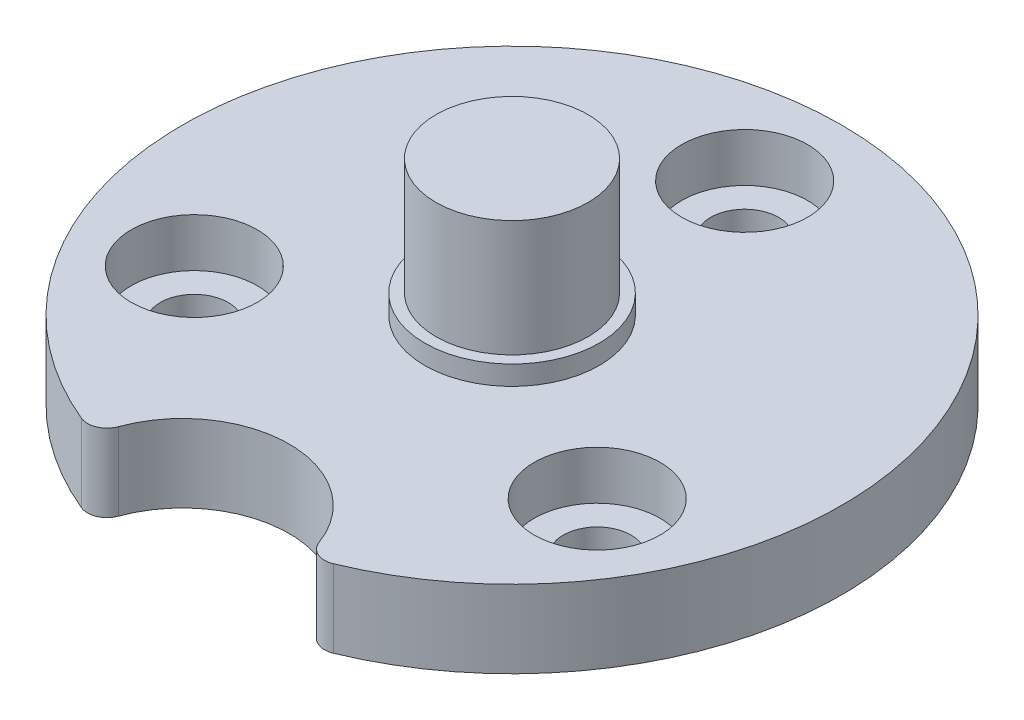
ISO-10303-21;
HEADER;
FILE_DESCRIPTION(('STEP AP214'),'2;1');
FILE_NAME('part.step','',(''),(''),'','','');
FILE_SCHEMA(('AUTOMOTIVE_DESIGN { 1 0 10303 214 1 1 1 1 }'));
ENDSEC;
DATA;
#1=APPLICATION_CONTEXT('core data for automotive mechanical design processes');
#2=APPLICATION_PROTOCOL_DEFINITION('international standard','automotive_design',2000,#1);
#3=PRODUCT_CONTEXT('',#1,'mechanical');
#4=PRODUCT('Part','Part','',(#3));
#5=PRODUCT_RELATED_PRODUCT_CATEGORY('part','',(#4));
#6=PRODUCT_DEFINITION_FORMATION('','',#4);
#7=PRODUCT_DEFINITION_CONTEXT('part definition',#1,'design');
#8=PRODUCT_DEFINITION('design','',#6,#7);
#9=PRODUCT_DEFINITION_SHAPE('','',#8);
#10=(LENGTH_UNIT() NAMED_UNIT(*) SI_UNIT(.MILLI.,.METRE.));
#11=(NAMED_UNIT(*) PLANE_ANGLE_UNIT() SI_UNIT($,.RADIAN.));
#12=(NAMED_UNIT(*) SI_UNIT($,.STERADIAN.) SOLID_ANGLE_UNIT());
#13=UNCERTAINTY_MEASURE_WITH_UNIT(LENGTH_MEASURE(1.E-05),#10,'distance_accuracy_value','');
#14=(GEOMETRIC_REPRESENTATION_CONTEXT(3) GLOBAL_UNCERTAINTY_ASSIGNED_CONTEXT((#13)) GLOBAL_UNIT_ASSIGNED_CONTEXT((#10,
#11,#12)) REPRESENTATION_CONTEXT('',''));
#15=CARTESIAN_POINT('',(0.,0.,0.));
#16=DIRECTION('',(0.,0.,1.));
#17=DIRECTION('',(1.,0.,0.));
#18=AXIS2_PLACEMENT_3D('',#15,#16,#17);
#19=CARTESIAN_POINT('',(0.,4.,-12.));
#20=DIRECTION('',(0.,-1.,0.));
#21=DIRECTION('',(0.,0.,-1.));
#22=AXIS2_PLACEMENT_3D('',#19,#20,#21);
#23=CYLINDRICAL_SURFACE('',#22,1.75);
#24=CARTESIAN_POINT('',(0.,0.,-12.));
#25=DIRECTION('',(0.,1.,0.));
#26=DIRECTION('',(0.,0.,1.));
#27=AXIS2_PLACEMENT_3D('',#24,#25,#26);
#28=CIRCLE('',#27,1.75);
#29=CARTESIAN_POINT('',(0.,0.,-10.25));
#30=VERTEX_POINT('',#29);
#31=EDGE_CURVE('E146',#30,#30,#28,.T.);
#32=ORIENTED_EDGE('',*,*,#31,.F.);
#33=EDGE_LOOP('',(#32));
#34=FACE_BOUND('',#33,.T.);
#35=CARTESIAN_POINT('',(0.,1.5,-12.));
#36=DIRECTION('',(0.,1.,0.));
#37=DIRECTION('',(0.,0.,1.));
#38=AXIS2_PLACEMENT_3D('',#35,#36,#37);
#39=CIRCLE('',#38,1.75);
#40=CARTESIAN_POINT('',(0.,1.5,-10.25));
#41=VERTEX_POINT('',#40);
#42=EDGE_CURVE('E143',#41,#41,#39,.T.);
#43=ORIENTED_EDGE('',*,*,#42,.T.);
#44=EDGE_LOOP('',(#43));
#45=FACE_BOUND('',#44,.T.);
#46=ADVANCED_FACE('F41',(#34,#45),#23,.F.);
#47=CARTESIAN_POINT('',(10.3923048454138,4.,5.99999999999971));
#48=DIRECTION('',(0.,-1.,0.));
#49=DIRECTION('',(0.,0.,-1.));
#50=AXIS2_PLACEMENT_3D('',#47,#48,#49);
#51=CYLINDRICAL_SURFACE('',#50,1.75);
#52=CARTESIAN_POINT('',(10.3923048454138,0.,5.99999999999971));
#53=DIRECTION('',(0.,1.,0.));
#54=DIRECTION('',(0.,0.,1.));
#55=AXIS2_PLACEMENT_3D('',#52,#53,#54);
#56=CIRCLE('',#55,1.75);
#57=CARTESIAN_POINT('',(10.3923048454138,0.,7.74999999999971));
#58=VERTEX_POINT('',#57);
#59=EDGE_CURVE('E142',#58,#58,#56,.T.);
#60=ORIENTED_EDGE('',*,*,#59,.F.);
#61=EDGE_LOOP('',(#60));
#62=FACE_BOUND('',#61,.T.);
#63=CARTESIAN_POINT('',(10.3923048454138,1.5,5.99999999999971));
#64=DIRECTION('',(0.,1.,0.));
#65=DIRECTION('',(0.,0.,1.));
#66=AXIS2_PLACEMENT_3D('',#63,#64,#65);
#67=CIRCLE('',#66,1.75);
#68=CARTESIAN_POINT('',(10.3923048454138,1.5,7.74999999999971));
#69=VERTEX_POINT('',#68);
#70=EDGE_CURVE('E154',#69,#69,#67,.T.);
#71=ORIENTED_EDGE('',*,*,#70,.T.);
#72=EDGE_LOOP('',(#71));
#73=FACE_BOUND('',#72,.T.);
#74=ADVANCED_FACE('F195',(#62,#73),#51,.F.);
#75=CARTESIAN_POINT('',(-10.3923048454128,4.,6.0000000000003));
#76=DIRECTION('',(0.,-1.,0.));
#77=DIRECTION('',(0.,0.,-1.));
#78=AXIS2_PLACEMENT_3D('',#75,#76,#77);
#79=CYLINDRICAL_SURFACE('',#78,1.75);
#80=CARTESIAN_POINT('',(-10.3923048454128,0.,6.0000000000003));
#81=DIRECTION('',(0.,1.,0.));
#82=DIRECTION('',(0.,0.,1.));
#83=AXIS2_PLACEMENT_3D('',#80,#81,#82);
#84=CIRCLE('',#83,1.75);
#85=CARTESIAN_POINT('',(-10.3923048454128,0.,7.7500000000003));
#86=VERTEX_POINT('',#85);
#87=EDGE_CURVE('E139',#86,#86,#84,.T.);
#88=ORIENTED_EDGE('',*,*,#87,.F.);
#89=EDGE_LOOP('',(#88));
#90=FACE_BOUND('',#89,.T.);
#91=CARTESIAN_POINT('',(-10.3923048454128,1.5,6.0000000000003));
#92=DIRECTION('',(0.,1.,0.));
#93=DIRECTION('',(0.,0.,1.));
#94=AXIS2_PLACEMENT_3D('',#91,#92,#93);
#95=CIRCLE('',#94,1.75);
#96=CARTESIAN_POINT('',(-10.3923048454128,1.5,7.7500000000003));
#97=VERTEX_POINT('',#96);
#98=EDGE_CURVE('E124',#97,#97,#95,.T.);
#99=ORIENTED_EDGE('',*,*,#98,.T.);
#100=EDGE_LOOP('',(#99));
#101=FACE_BOUND('',#100,.T.);
#102=ADVANCED_FACE('F168',(#90,#101),#79,.F.);
#103=CARTESIAN_POINT('',(0.,4.,0.));
#104=DIRECTION('',(0.,1.,0.));
#105=DIRECTION('',(0.,0.,1.));
#106=AXIS2_PLACEMENT_3D('',#103,#104,#105);
#107=PLANE('',#106);
#108=CARTESIAN_POINT('',(0.,4.,0.));
#109=DIRECTION('',(0.,1.,0.));
#110=DIRECTION('',(0.,0.,1.));
#111=AXIS2_PLACEMENT_3D('',#108,#109,#110);
#112=CIRCLE('',#111,17.);
#113=CARTESIAN_POINT('',(6.49356934752327,4.,15.7109375));
#114=VERTEX_POINT('',#113);
#115=CARTESIAN_POINT('',(-6.49356934752327,4.,15.7109375));
#116=VERTEX_POINT('',#115);
#117=EDGE_CURVE('E114',#114,#116,#112,.T.);
#118=ORIENTED_EDGE('',*,*,#117,.T.);
#119=CARTESIAN_POINT('',(-6.1115946800219,4.,14.7867647058824));
#120=DIRECTION('',(0.,1.,0.));
#121=DIRECTION('',(0.,0.,1.));
#122=AXIS2_PLACEMENT_3D('',#119,#120,#121);
#123=CIRCLE('',#122,1.);
#124=CARTESIAN_POINT('',(-5.17134934463391,4.,15.1272624434389));
#125=VERTEX_POINT('',#124);
#126=EDGE_CURVE('E11',#116,#125,#123,.T.);
#127=ORIENTED_EDGE('',*,*,#126,.T.);
#128=CARTESIAN_POINT('',(0.,4.,17.));
#129=DIRECTION('',(0.,1.,0.));
#130=DIRECTION('',(0.,0.,1.));
#131=AXIS2_PLACEMENT_3D('',#128,#129,#130);
#132=CIRCLE('',#131,5.5);
#133=CARTESIAN_POINT('',(5.17134934463391,4.,15.1272624434389));
#134=VERTEX_POINT('',#133);
#135=EDGE_CURVE('E98',#134,#125,#132,.T.);
#136=ORIENTED_EDGE('',*,*,#135,.F.);
#137=CARTESIAN_POINT('',(6.1115946800219,4.,14.7867647058824));
#138=DIRECTION('',(0.,1.,0.));
#139=DIRECTION('',(0.,0.,1.));
#140=AXIS2_PLACEMENT_3D('',#137,#138,#139);
#141=CIRCLE('',#140,1.);
#142=EDGE_CURVE('E49',#134,#114,#141,.T.);
#143=ORIENTED_EDGE('',*,*,#142,.T.);
#144=EDGE_LOOP('',(#118,#127,#136,#143));
#145=FACE_BOUND('',#144,.T.);
#146=CARTESIAN_POINT('',(0.,4.,0.));
#147=DIRECTION('',(0.,1.,0.));
#148=DIRECTION('',(0.,0.,1.));
#149=AXIS2_PLACEMENT_3D('',#146,#147,#148);
#150=CIRCLE('',#149,4.5);
#151=CARTESIAN_POINT('',(0.,4.,4.5));
#152=VERTEX_POINT('',#151);
#153=EDGE_CURVE('E107',#152,#152,#150,.T.);
#154=ORIENTED_EDGE('',*,*,#153,.F.);
#155=EDGE_LOOP('',(#154));
#156=FACE_BOUND('',#155,.T.);
#157=CARTESIAN_POINT('',(0.,4.,-12.));
#158=DIRECTION('',(0.,1.,0.));
#159=DIRECTION('',(0.,0.,1.));
#160=AXIS2_PLACEMENT_3D('',#157,#158,#159);
#161=CIRCLE('',#160,3.25);
#162=CARTESIAN_POINT('',(0.,4.,-8.75));
#163=VERTEX_POINT('',#162);
#164=EDGE_CURVE('E125',#163,#163,#161,.T.);
#165=ORIENTED_EDGE('',*,*,#164,.F.);
#166=EDGE_LOOP('',(#165));
#167=FACE_BOUND('',#166,.T.);
#168=CARTESIAN_POINT('',(10.3923048454133,4.,6.));
#169=DIRECTION('',(0.,1.,0.));
#170=DIRECTION('',(0.,0.,1.));
#171=AXIS2_PLACEMENT_3D('',#168,#169,#170);
#172=CIRCLE('',#171,3.25);
#173=CARTESIAN_POINT('',(10.3923048454133,4.,9.25));
#174=VERTEX_POINT('',#173);
#175=EDGE_CURVE('E131',#174,#174,#172,.T.);
#176=ORIENTED_EDGE('',*,*,#175,.F.);
#177=EDGE_LOOP('',(#176));
#178=FACE_BOUND('',#177,.T.);
#179=CARTESIAN_POINT('',(-10.3923048454133,4.,6.00000000000001));
#180=DIRECTION('',(0.,1.,0.));
#181=DIRECTION('',(0.,0.,1.));
#182=AXIS2_PLACEMENT_3D('',#179,#180,#181);
#183=CIRCLE('',#182,3.25);
#184=CARTESIAN_POINT('',(-10.3923048454133,4.,9.25000000000001));
#185=VERTEX_POINT('',#184);
#186=EDGE_CURVE('E118',#185,#185,#183,.T.);
#187=ORIENTED_EDGE('',*,*,#186,.F.);
#188=EDGE_LOOP('',(#187));
#189=FACE_BOUND('',#188,.T.);
#190=ADVANCED_FACE('F165',(#145,#156,#167,#178,#189),#107,.T.);
#191=CARTESIAN_POINT('',(0.,0.,0.));
#192=DIRECTION('',(0.,1.,0.));
#193=DIRECTION('',(0.,0.,1.));
#194=AXIS2_PLACEMENT_3D('',#191,#192,#193);
#195=PLANE('',#194);
#196=CARTESIAN_POINT('',(0.,0.,17.));
#197=DIRECTION('',(0.,1.,0.));
#198=DIRECTION('',(0.,0.,1.));
#199=AXIS2_PLACEMENT_3D('',#196,#197,#198);
#200=CIRCLE('',#199,5.5);
#201=CARTESIAN_POINT('',(-5.17134934463391,0.,15.1272624434389));
#202=VERTEX_POINT('',#201);
#203=CARTESIAN_POINT('',(5.17134934463391,0.,15.1272624434389));
#204=VERTEX_POINT('',#203);
#205=EDGE_CURVE('E96',#202,#204,#200,.F.);
#206=ORIENTED_EDGE('',*,*,#205,.F.);
#207=CARTESIAN_POINT('',(-6.1115946800219,0.,14.7867647058824));
#208=DIRECTION('',(0.,1.,0.));
#209=DIRECTION('',(0.,0.,1.));
#210=AXIS2_PLACEMENT_3D('',#207,#208,#209);
#211=CIRCLE('',#210,1.);
#212=CARTESIAN_POINT('',(-6.49356934752327,0.,15.7109375));
#213=VERTEX_POINT('',#212);
#214=EDGE_CURVE('E80',#202,#213,#211,.F.);
#215=ORIENTED_EDGE('',*,*,#214,.T.);
#216=CARTESIAN_POINT('',(0.,0.,0.));
#217=DIRECTION('',(0.,1.,0.));
#218=DIRECTION('',(0.,0.,1.));
#219=AXIS2_PLACEMENT_3D('',#216,#217,#218);
#220=CIRCLE('',#219,17.);
#221=CARTESIAN_POINT('',(6.49356934752327,0.,15.7109375));
#222=VERTEX_POINT('',#221);
#223=EDGE_CURVE('E149',#222,#213,#220,.T.);
#224=ORIENTED_EDGE('',*,*,#223,.F.);
#225=CARTESIAN_POINT('',(6.1115946800219,0.,14.7867647058824));
#226=DIRECTION('',(0.,1.,0.));
#227=DIRECTION('',(0.,0.,1.));
#228=AXIS2_PLACEMENT_3D('',#225,#226,#227);
#229=CIRCLE('',#228,1.);
#230=EDGE_CURVE('E89',#222,#204,#229,.F.);
#231=ORIENTED_EDGE('',*,*,#230,.T.);
#232=EDGE_LOOP('',(#206,#215,#224,#231));
#233=FACE_BOUND('',#232,.T.);
#234=ORIENTED_EDGE('',*,*,#31,.T.);
#235=EDGE_LOOP('',(#234));
#236=FACE_BOUND('',#235,.T.);
#237=ORIENTED_EDGE('',*,*,#59,.T.);
#238=EDGE_LOOP('',(#237));
#239=FACE_BOUND('',#238,.T.);
#240=ORIENTED_EDGE('',*,*,#87,.T.);
#241=EDGE_LOOP('',(#240));
#242=FACE_BOUND('',#241,.T.);
#243=ADVANCED_FACE('F101',(#233,#236,#239,#242),#195,.F.);
#244=CARTESIAN_POINT('',(0.,4.,0.));
#245=DIRECTION('',(0.,-1.,0.));
#246=DIRECTION('',(0.,0.,-1.));
#247=AXIS2_PLACEMENT_3D('',#244,#245,#246);
#248=CYLINDRICAL_SURFACE('',#247,17.);
#249=ORIENTED_EDGE('',*,*,#223,.T.);
#250=DIRECTION('',(0.,-1.,0.));
#251=VECTOR('',#250,1.);
#252=CARTESIAN_POINT('',(-6.49356934752327,4.,15.7109375));
#253=LINE('',#252,#251);
#254=EDGE_CURVE('E56',#213,#116,#253,.F.);
#255=ORIENTED_EDGE('',*,*,#254,.T.);
#256=ORIENTED_EDGE('',*,*,#117,.F.);
#257=DIRECTION('',(0.,-1.,0.));
#258=VECTOR('',#257,1.);
#259=CARTESIAN_POINT('',(6.49356934752327,4.,15.7109375));
#260=LINE('',#259,#258);
#261=EDGE_CURVE('E88',#114,#222,#260,.T.);
#262=ORIENTED_EDGE('',*,*,#261,.T.);
#263=EDGE_LOOP('',(#249,#255,#256,#262));
#264=FACE_BOUND('',#263,.T.);
#265=ADVANCED_FACE('F163',(#264),#248,.T.);
#266=CARTESIAN_POINT('',(-10.3923048454133,1.5,6.00000000000001));
#267=DIRECTION('',(0.,1.,0.));
#268=DIRECTION('',(0.,0.,1.));
#269=AXIS2_PLACEMENT_3D('',#266,#267,#268);
#270=CYLINDRICAL_SURFACE('',#269,3.25);
#271=CARTESIAN_POINT('',(-10.3923048454133,1.5,6.00000000000001));
#272=DIRECTION('',(0.,1.,0.));
#273=DIRECTION('',(0.,0.,1.));
#274=AXIS2_PLACEMENT_3D('',#271,#272,#273);
#275=CIRCLE('',#274,3.25);
#276=CARTESIAN_POINT('',(-10.3923048454133,1.5,9.25000000000001));
#277=VERTEX_POINT('',#276);
#278=EDGE_CURVE('E134',#277,#277,#275,.T.);
#279=ORIENTED_EDGE('',*,*,#278,.F.);
#280=EDGE_LOOP('',(#279));
#281=FACE_BOUND('',#280,.T.);
#282=ORIENTED_EDGE('',*,*,#186,.T.);
#283=EDGE_LOOP('',(#282));
#284=FACE_BOUND('',#283,.T.);
#285=ADVANCED_FACE('F178',(#281,#284),#270,.F.);
#286=CARTESIAN_POINT('',(-10.3923048454133,1.5,6.00000000000001));
#287=DIRECTION('',(0.,1.,0.));
#288=DIRECTION('',(0.,0.,1.));
#289=AXIS2_PLACEMENT_3D('',#286,#287,#288);
#290=PLANE('',#289);
#291=ORIENTED_EDGE('',*,*,#98,.F.);
#292=EDGE_LOOP('',(#291));
#293=FACE_BOUND('',#292,.T.);
#294=ORIENTED_EDGE('',*,*,#278,.T.);
#295=EDGE_LOOP('',(#294));
#296=FACE_BOUND('',#295,.T.);
#297=ADVANCED_FACE('F180',(#293,#296),#290,.T.);
#298=CARTESIAN_POINT('',(10.3923048454133,1.5,6.));
#299=DIRECTION('',(0.,1.,0.));
#300=DIRECTION('',(0.,0.,1.));
#301=AXIS2_PLACEMENT_3D('',#298,#299,#300);
#302=CYLINDRICAL_SURFACE('',#301,3.25);
#303=CARTESIAN_POINT('',(10.3923048454133,1.5,6.));
#304=DIRECTION('',(0.,1.,0.));
#305=DIRECTION('',(0.,0.,1.));
#306=AXIS2_PLACEMENT_3D('',#303,#304,#305);
#307=CIRCLE('',#306,3.25);
#308=CARTESIAN_POINT('',(10.3923048454133,1.5,9.25));
#309=VERTEX_POINT('',#308);
#310=EDGE_CURVE('E128',#309,#309,#307,.T.);
#311=ORIENTED_EDGE('',*,*,#310,.F.);
#312=EDGE_LOOP('',(#311));
#313=FACE_BOUND('',#312,.T.);
#314=ORIENTED_EDGE('',*,*,#175,.T.);
#315=EDGE_LOOP('',(#314));
#316=FACE_BOUND('',#315,.T.);
#317=ADVANCED_FACE('F187',(#313,#316),#302,.F.);
#318=CARTESIAN_POINT('',(10.3923048454133,1.5,6.));
#319=DIRECTION('',(0.,1.,0.));
#320=DIRECTION('',(0.,0.,1.));
#321=AXIS2_PLACEMENT_3D('',#318,#319,#320);
#322=PLANE('',#321);
#323=ORIENTED_EDGE('',*,*,#70,.F.);
#324=EDGE_LOOP('',(#323));
#325=FACE_BOUND('',#324,.T.);
#326=ORIENTED_EDGE('',*,*,#310,.T.);
#327=EDGE_LOOP('',(#326));
#328=FACE_BOUND('',#327,.T.);
#329=ADVANCED_FACE('F239',(#325,#328),#322,.T.);
#330=CARTESIAN_POINT('',(0.,1.5,-12.));
#331=DIRECTION('',(0.,1.,0.));
#332=DIRECTION('',(0.,0.,1.));
#333=AXIS2_PLACEMENT_3D('',#330,#331,#332);
#334=CYLINDRICAL_SURFACE('',#333,3.25);
#335=CARTESIAN_POINT('',(0.,1.5,-12.));
#336=DIRECTION('',(0.,1.,0.));
#337=DIRECTION('',(0.,0.,1.));
#338=AXIS2_PLACEMENT_3D('',#335,#336,#337);
#339=CIRCLE('',#338,3.25);
#340=CARTESIAN_POINT('',(0.,1.5,-8.75));
#341=VERTEX_POINT('',#340);
#342=EDGE_CURVE('E121',#341,#341,#339,.T.);
#343=ORIENTED_EDGE('',*,*,#342,.F.);
#344=EDGE_LOOP('',(#343));
#345=FACE_BOUND('',#344,.T.);
#346=ORIENTED_EDGE('',*,*,#164,.T.);
#347=EDGE_LOOP('',(#346));
#348=FACE_BOUND('',#347,.T.);
#349=ADVANCED_FACE('F235',(#345,#348),#334,.F.);
#350=CARTESIAN_POINT('',(0.,1.5,-12.));
#351=DIRECTION('',(0.,1.,0.));
#352=DIRECTION('',(0.,0.,1.));
#353=AXIS2_PLACEMENT_3D('',#350,#351,#352);
#354=PLANE('',#353);
#355=ORIENTED_EDGE('',*,*,#42,.F.);
#356=EDGE_LOOP('',(#355));
#357=FACE_BOUND('',#356,.T.);
#358=ORIENTED_EDGE('',*,*,#342,.T.);
#359=EDGE_LOOP('',(#358));
#360=FACE_BOUND('',#359,.T.);
#361=ADVANCED_FACE('F231',(#357,#360),#354,.T.);
#362=CARTESIAN_POINT('',(0.,5.,0.));
#363=DIRECTION('',(0.,-1.,0.));
#364=DIRECTION('',(0.,0.,-1.));
#365=AXIS2_PLACEMENT_3D('',#362,#363,#364);
#366=CYLINDRICAL_SURFACE('',#365,4.5);
#367=CARTESIAN_POINT('',(0.,5.,0.));
#368=DIRECTION('',(0.,1.,0.));
#369=DIRECTION('',(0.,0.,1.));
#370=AXIS2_PLACEMENT_3D('',#367,#368,#369);
#371=CIRCLE('',#370,4.5);
#372=CARTESIAN_POINT('',(0.,5.,4.5));
#373=VERTEX_POINT('',#372);
#374=EDGE_CURVE('E115',#373,#373,#371,.T.);
#375=ORIENTED_EDGE('',*,*,#374,.F.);
#376=EDGE_LOOP('',(#375));
#377=FACE_BOUND('',#376,.T.);
#378=ORIENTED_EDGE('',*,*,#153,.T.);
#379=EDGE_LOOP('',(#378));
#380=FACE_BOUND('',#379,.T.);
#381=ADVANCED_FACE('F227',(#377,#380),#366,.T.);
#382=CARTESIAN_POINT('',(0.,5.,0.));
#383=DIRECTION('',(0.,1.,0.));
#384=DIRECTION('',(0.,0.,1.));
#385=AXIS2_PLACEMENT_3D('',#382,#383,#384);
#386=PLANE('',#385);
#387=CARTESIAN_POINT('',(0.,5.,0.));
#388=DIRECTION('',(0.,1.,0.));
#389=DIRECTION('',(0.,0.,1.));
#390=AXIS2_PLACEMENT_3D('',#387,#388,#389);
#391=CIRCLE('',#390,3.925);
#392=CARTESIAN_POINT('',(0.,5.,3.925));
#393=VERTEX_POINT('',#392);
#394=EDGE_CURVE('E111',#393,#393,#391,.T.);
#395=ORIENTED_EDGE('',*,*,#394,.F.);
#396=EDGE_LOOP('',(#395));
#397=FACE_BOUND('',#396,.T.);
#398=ORIENTED_EDGE('',*,*,#374,.T.);
#399=EDGE_LOOP('',(#398));
#400=FACE_BOUND('',#399,.T.);
#401=ADVANCED_FACE('F223',(#397,#400),#386,.T.);
#402=CARTESIAN_POINT('',(0.,11.,0.));
#403=DIRECTION('',(0.,-1.,0.));
#404=DIRECTION('',(0.,0.,-1.));
#405=AXIS2_PLACEMENT_3D('',#402,#403,#404);
#406=CYLINDRICAL_SURFACE('',#405,3.925);
#407=CARTESIAN_POINT('',(0.,11.,0.));
#408=DIRECTION('',(0.,1.,0.));
#409=DIRECTION('',(0.,0.,1.));
#410=AXIS2_PLACEMENT_3D('',#407,#408,#409);
#411=CIRCLE('',#410,3.925);
#412=CARTESIAN_POINT('',(0.,11.,3.925));
#413=VERTEX_POINT('',#412);
#414=EDGE_CURVE('E104',#413,#413,#411,.T.);
#415=ORIENTED_EDGE('',*,*,#414,.F.);
#416=EDGE_LOOP('',(#415));
#417=FACE_BOUND('',#416,.T.);
#418=ORIENTED_EDGE('',*,*,#394,.T.);
#419=EDGE_LOOP('',(#418));
#420=FACE_BOUND('',#419,.T.);
#421=ADVANCED_FACE('F217',(#417,#420),#406,.T.);
#422=CARTESIAN_POINT('',(0.,11.,0.));
#423=DIRECTION('',(0.,1.,0.));
#424=DIRECTION('',(0.,0.,1.));
#425=AXIS2_PLACEMENT_3D('',#422,#423,#424);
#426=PLANE('',#425);
#427=ORIENTED_EDGE('',*,*,#414,.T.);
#428=EDGE_LOOP('',(#427));
#429=FACE_BOUND('',#428,.T.);
#430=ADVANCED_FACE('F212',(#429),#426,.T.);
#431=CARTESIAN_POINT('',(0.,-0.00100000000000013,17.));
#432=DIRECTION('',(0.,1.,0.));
#433=DIRECTION('',(0.,0.,1.));
#434=AXIS2_PLACEMENT_3D('',#431,#432,#433);
#435=CYLINDRICAL_SURFACE('',#434,5.5);
#436=ORIENTED_EDGE('',*,*,#135,.T.);
#437=DIRECTION('',(0.,1.,0.));
#438=VECTOR('',#437,1.);
#439=CARTESIAN_POINT('',(-5.17134934463391,-0.00100000000000013,15.1272624434389));
#440=LINE('',#439,#438);
#441=EDGE_CURVE('E84',#125,#202,#440,.F.);
#442=ORIENTED_EDGE('',*,*,#441,.T.);
#443=ORIENTED_EDGE('',*,*,#205,.T.);
#444=DIRECTION('',(0.,1.,0.));
#445=VECTOR('',#444,1.);
#446=CARTESIAN_POINT('',(5.17134934463391,-0.00100000000000013,15.1272624434389));
#447=LINE('',#446,#445);
#448=EDGE_CURVE('E99',#204,#134,#447,.T.);
#449=ORIENTED_EDGE('',*,*,#448,.T.);
#450=EDGE_LOOP('',(#436,#442,#443,#449));
#451=FACE_BOUND('',#450,.T.);
#452=ADVANCED_FACE('F94',(#451),#435,.F.);
#453=CARTESIAN_POINT('',(-6.1115946800219,4.,14.7867647058824));
#454=DIRECTION('',(0.,1.,0.));
#455=DIRECTION('',(0.,0.,1.));
#456=AXIS2_PLACEMENT_3D('',#453,#454,#455);
#457=CYLINDRICAL_SURFACE('',#456,1.);
#458=ORIENTED_EDGE('',*,*,#126,.F.);
#459=ORIENTED_EDGE('',*,*,#254,.F.);
#460=ORIENTED_EDGE('',*,*,#214,.F.);
#461=ORIENTED_EDGE('',*,*,#441,.F.);
#462=EDGE_LOOP('',(#458,#459,#460,#461));
#463=FACE_BOUND('',#462,.T.);
#464=ADVANCED_FACE('F83',(#463),#457,.T.);
#465=CARTESIAN_POINT('',(6.1115946800219,4.,14.7867647058824));
#466=DIRECTION('',(0.,-1.,0.));
#467=DIRECTION('',(0.,0.,-1.));
#468=AXIS2_PLACEMENT_3D('',#465,#466,#467);
#469=CYLINDRICAL_SURFACE('',#468,1.);
#470=ORIENTED_EDGE('',*,*,#230,.F.);
#471=ORIENTED_EDGE('',*,*,#261,.F.);
#472=ORIENTED_EDGE('',*,*,#142,.F.);
#473=ORIENTED_EDGE('',*,*,#448,.F.);
#474=EDGE_LOOP('',(#470,#471,#472,#473));
#475=FACE_BOUND('',#474,.T.);
#476=ADVANCED_FACE('F43',(#475),#469,.T.);
#477=CLOSED_SHELL('',(#46,#74,#102,#190,#243,#265,#285,#297,#317,#329,#349,#361,#381,#401,#421,
#430,#452,#464,#476));
#478=MANIFOLD_SOLID_BREP('B2',#477);
#479=ADVANCED_BREP_SHAPE_REPRESENTATION('',(#18,#478),#14);
#480=SHAPE_DEFINITION_REPRESENTATION(#9,#479);
ENDSEC;
END-ISO-10303-21;
